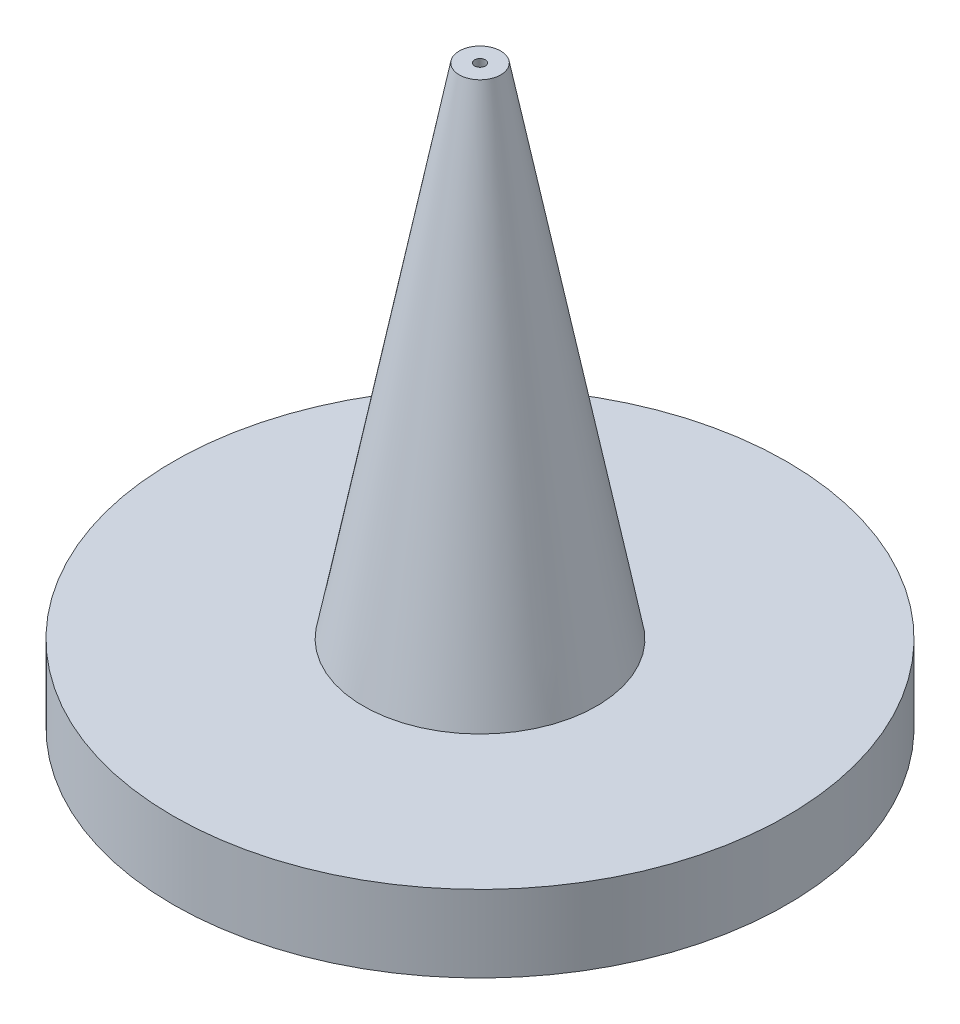
ISO-10303-21;
HEADER;
FILE_DESCRIPTION(('STEP AP214'),'2;1');
FILE_NAME('part.step','',(''),(''),'','','');
FILE_SCHEMA(('AUTOMOTIVE_DESIGN { 1 0 10303 214 1 1 1 1 }'));
ENDSEC;
DATA;
#1=APPLICATION_CONTEXT('core data for automotive mechanical design processes');
#2=APPLICATION_PROTOCOL_DEFINITION('international standard','automotive_design',2000,#1);
#3=PRODUCT_CONTEXT('',#1,'mechanical');
#4=PRODUCT('Part','Part','',(#3));
#5=PRODUCT_RELATED_PRODUCT_CATEGORY('part','',(#4));
#6=PRODUCT_DEFINITION_FORMATION('','',#4);
#7=PRODUCT_DEFINITION_CONTEXT('part definition',#1,'design');
#8=PRODUCT_DEFINITION('design','',#6,#7);
#9=PRODUCT_DEFINITION_SHAPE('','',#8);
#10=(LENGTH_UNIT() NAMED_UNIT(*) SI_UNIT(.MILLI.,.METRE.));
#11=(NAMED_UNIT(*) PLANE_ANGLE_UNIT() SI_UNIT($,.RADIAN.));
#12=(NAMED_UNIT(*) SI_UNIT($,.STERADIAN.) SOLID_ANGLE_UNIT());
#13=UNCERTAINTY_MEASURE_WITH_UNIT(LENGTH_MEASURE(1.E-05),#10,'distance_accuracy_value','');
#14=(GEOMETRIC_REPRESENTATION_CONTEXT(3) GLOBAL_UNCERTAINTY_ASSIGNED_CONTEXT((#13)) GLOBAL_UNIT_ASSIGNED_CONTEXT((#10,
#11,#12)) REPRESENTATION_CONTEXT('',''));
#15=CARTESIAN_POINT('',(0.,0.,0.));
#16=DIRECTION('',(0.,0.,1.));
#17=DIRECTION('',(1.,0.,0.));
#18=AXIS2_PLACEMENT_3D('',#15,#16,#17);
#19=CARTESIAN_POINT('',(0.,0.,0.));
#20=DIRECTION('',(0.,-1.,0.));
#21=DIRECTION('',(0.,0.,-1.));
#22=AXIS2_PLACEMENT_3D('',#19,#20,#21);
#23=CYLINDRICAL_SURFACE('',#22,10.16);
#24=CARTESIAN_POINT('',(0.,2.54,0.));
#25=DIRECTION('',(0.,-1.,0.));
#26=DIRECTION('',(0.,0.,-1.));
#27=AXIS2_PLACEMENT_3D('',#24,#25,#26);
#28=CIRCLE('',#27,10.16);
#29=CARTESIAN_POINT('',(0.,2.54,-10.16));
#30=VERTEX_POINT('',#29);
#31=EDGE_CURVE('E10',#30,#30,#28,.T.);
#32=ORIENTED_EDGE('',*,*,#31,.T.);
#33=EDGE_LOOP('',(#32));
#34=FACE_BOUND('',#33,.T.);
#35=CARTESIAN_POINT('',(0.,0.,0.));
#36=DIRECTION('',(0.,-1.,0.));
#37=DIRECTION('',(0.,0.,-1.));
#38=AXIS2_PLACEMENT_3D('',#35,#36,#37);
#39=CIRCLE('',#38,10.16);
#40=CARTESIAN_POINT('',(0.,0.,-10.16));
#41=VERTEX_POINT('',#40);
#42=EDGE_CURVE('E54',#41,#41,#39,.T.);
#43=ORIENTED_EDGE('',*,*,#42,.F.);
#44=EDGE_LOOP('',(#43));
#45=FACE_BOUND('',#44,.T.);
#46=ADVANCED_FACE('F32',(#34,#45),#23,.T.);
#47=CARTESIAN_POINT('',(0.,2.54,0.));
#48=DIRECTION('',(0.,1.,0.));
#49=DIRECTION('',(0.,0.,1.));
#50=AXIS2_PLACEMENT_3D('',#47,#48,#49);
#51=PLANE('',#50);
#52=CARTESIAN_POINT('',(0.,2.54,0.));
#53=DIRECTION('',(0.,-1.,0.));
#54=DIRECTION('',(0.,0.,-1.));
#55=AXIS2_PLACEMENT_3D('',#52,#53,#54);
#56=CIRCLE('',#55,3.8608);
#57=CARTESIAN_POINT('',(0.,2.54,-3.8608));
#58=VERTEX_POINT('',#57);
#59=EDGE_CURVE('E38',#58,#58,#56,.T.);
#60=ORIENTED_EDGE('',*,*,#59,.T.);
#61=EDGE_LOOP('',(#60));
#62=FACE_BOUND('',#61,.T.);
#63=ORIENTED_EDGE('',*,*,#31,.F.);
#64=EDGE_LOOP('',(#63));
#65=FACE_BOUND('',#64,.T.);
#66=ADVANCED_FACE('F62',(#62,#65),#51,.T.);
#67=CARTESIAN_POINT('',(0.,19.05,0.));
#68=DIRECTION('',(0.,-1.,0.));
#69=DIRECTION('',(0.,0.,-1.));
#70=AXIS2_PLACEMENT_3D('',#67,#68,#69);
#71=CONICAL_SURFACE('',#70,0.6858,0.189988287918716);
#72=CARTESIAN_POINT('',(0.,19.05,0.));
#73=DIRECTION('',(0.,-1.,0.));
#74=DIRECTION('',(0.,0.,-1.));
#75=AXIS2_PLACEMENT_3D('',#72,#73,#74);
#76=CIRCLE('',#75,0.6858);
#77=CARTESIAN_POINT('',(0.,19.05,-0.6858));
#78=VERTEX_POINT('',#77);
#79=EDGE_CURVE('E42',#78,#78,#76,.T.);
#80=CARTESIAN_POINT('',(0.,2.54,-3.8608));
#81=CARTESIAN_POINT('',(0.,2.71197916666667,-3.82772708333333));
#82=CARTESIAN_POINT('',(0.,2.88395833333333,-3.79465416666667));
#83=CARTESIAN_POINT('',(0.,3.22791666666667,-3.72850833333333));
#84=CARTESIAN_POINT('',(0.,3.39989583333333,-3.69543541666667));
#85=CARTESIAN_POINT('',(0.,3.74385416666667,-3.62928958333333));
#86=CARTESIAN_POINT('',(0.,3.91583333333333,-3.59621666666667));
#87=CARTESIAN_POINT('',(0.,4.25979166666667,-3.53007083333333));
#88=CARTESIAN_POINT('',(0.,4.43177083333333,-3.49699791666667));
#89=CARTESIAN_POINT('',(0.,4.77572916666667,-3.43085208333333));
#90=CARTESIAN_POINT('',(0.,4.94770833333333,-3.39777916666667));
#91=CARTESIAN_POINT('',(0.,5.29166666666667,-3.33163333333333));
#92=CARTESIAN_POINT('',(0.,5.46364583333334,-3.29856041666667));
#93=CARTESIAN_POINT('',(0.,5.80760416666667,-3.23241458333333));
#94=CARTESIAN_POINT('',(0.,5.97958333333333,-3.19934166666667));
#95=CARTESIAN_POINT('',(0.,6.32354166666667,-3.13319583333333));
#96=CARTESIAN_POINT('',(0.,6.49552083333333,-3.10012291666667));
#97=CARTESIAN_POINT('',(0.,6.83947916666667,-3.03397708333333));
#98=CARTESIAN_POINT('',(0.,7.01145833333333,-3.00090416666667));
#99=CARTESIAN_POINT('',(0.,7.35541666666667,-2.93475833333333));
#100=CARTESIAN_POINT('',(0.,7.52739583333334,-2.90168541666667));
#101=CARTESIAN_POINT('',(0.,7.87135416666667,-2.83553958333333));
#102=CARTESIAN_POINT('',(0.,8.04333333333333,-2.80246666666667));
#103=CARTESIAN_POINT('',(0.,8.38729166666667,-2.73632083333333));
#104=CARTESIAN_POINT('',(0.,8.55927083333333,-2.70324791666667));
#105=CARTESIAN_POINT('',(0.,8.90322916666667,-2.63710208333333));
#106=CARTESIAN_POINT('',(0.,9.07520833333333,-2.60402916666667));
#107=CARTESIAN_POINT('',(0.,9.41916666666667,-2.53788333333333));
#108=CARTESIAN_POINT('',(0.,9.59114583333333,-2.50481041666667));
#109=CARTESIAN_POINT('',(0.,9.93510416666667,-2.43866458333333));
#110=CARTESIAN_POINT('',(0.,10.1070833333333,-2.40559166666667));
#111=CARTESIAN_POINT('',(0.,10.4510416666667,-2.33944583333333));
#112=CARTESIAN_POINT('',(0.,10.6230208333333,-2.30637291666667));
#113=CARTESIAN_POINT('',(0.,10.9669791666667,-2.24022708333333));
#114=CARTESIAN_POINT('',(0.,11.1389583333333,-2.20715416666667));
#115=CARTESIAN_POINT('',(0.,11.4829166666667,-2.14100833333333));
#116=CARTESIAN_POINT('',(0.,11.6548958333333,-2.10793541666667));
#117=CARTESIAN_POINT('',(0.,11.9988541666667,-2.04178958333333));
#118=CARTESIAN_POINT('',(0.,12.1708333333333,-2.00871666666667));
#119=CARTESIAN_POINT('',(0.,12.5147916666667,-1.94257083333333));
#120=CARTESIAN_POINT('',(0.,12.6867708333333,-1.90949791666667));
#121=CARTESIAN_POINT('',(0.,13.0307291666667,-1.84335208333333));
#122=CARTESIAN_POINT('',(0.,13.2027083333333,-1.81027916666667));
#123=CARTESIAN_POINT('',(0.,13.5466666666667,-1.74413333333333));
#124=CARTESIAN_POINT('',(0.,13.7186458333333,-1.71106041666667));
#125=CARTESIAN_POINT('',(0.,14.0626041666667,-1.64491458333333));
#126=CARTESIAN_POINT('',(0.,14.2345833333333,-1.61184166666667));
#127=CARTESIAN_POINT('',(0.,14.5785416666667,-1.54569583333333));
#128=CARTESIAN_POINT('',(0.,14.7505208333333,-1.51262291666667));
#129=CARTESIAN_POINT('',(0.,15.0944791666667,-1.44647708333333));
#130=CARTESIAN_POINT('',(0.,15.2664583333333,-1.41340416666667));
#131=CARTESIAN_POINT('',(0.,15.6104166666667,-1.34725833333333));
#132=CARTESIAN_POINT('',(0.,15.7823958333333,-1.31418541666667));
#133=CARTESIAN_POINT('',(0.,16.1263541666667,-1.24803958333333));
#134=CARTESIAN_POINT('',(0.,16.2983333333333,-1.21496666666667));
#135=CARTESIAN_POINT('',(0.,16.6422916666667,-1.14882083333333));
#136=CARTESIAN_POINT('',(0.,16.8142708333333,-1.11574791666667));
#137=CARTESIAN_POINT('',(0.,17.1582291666667,-1.04960208333333));
#138=CARTESIAN_POINT('',(0.,17.3302083333333,-1.01652916666667));
#139=CARTESIAN_POINT('',(0.,17.6741666666667,-0.950383333333333));
#140=CARTESIAN_POINT('',(0.,17.8461458333333,-0.917310416666666));
#141=CARTESIAN_POINT('',(0.,18.1901041666667,-0.851164583333333));
#142=CARTESIAN_POINT('',(0.,18.3620833333333,-0.818091666666666));
#143=CARTESIAN_POINT('',(0.,18.7060416666667,-0.751945833333333));
#144=CARTESIAN_POINT('',(0.,18.8780208333333,-0.718872916666666));
#145=CARTESIAN_POINT('',(0.,19.05,-0.685799999999999));
#146=B_SPLINE_CURVE_WITH_KNOTS('',3,(#80,#81,#82,#83,#84,#85,#86,#87,#88,#89,#90,#91,#92,#93,
#94,#95,#96,#97,#98,#99,#100,#101,#102,#103,#104,#105,#106,#107,#108,#109,#110,#111,#112,#113,
#114,#115,#116,#117,#118,#119,#120,#121,#122,#123,#124,#125,#126,#127,#128,#129,#130,#131,#132,
#133,#134,#135,#136,#137,#138,#139,#140,#141,#142,#143,#144,#145),.UNSPECIFIED.,.F.,.F.,(4,2,2,
2,2,2,2,2,2,2,2,2,2,2,2,2,2,2,2,2,2,2,2,2,2,2,2,2,2,2,2,2,4),(0.,0.525391153577802,
1.0507823071556,1.5761734607334,2.1015646143112,2.62695576788901,3.15234692146681,
3.67773807504461,4.20312922862241,4.72852038220021,5.25391153577801,5.77930268935581,
6.30469384293361,6.83008499651141,7.35547615008921,7.88086730366701,8.40625845724482,
8.93164961082262,9.45704076440042,9.98243191797822,10.507823071556,11.0332142251338,
11.5586053787116,12.0839965322894,12.6093876858672,13.134778839445,13.6601699930228,
14.1855611466006,14.7109523001784,15.2363434537562,15.761734607334,16.2871257609118,
16.8125169144896),.UNSPECIFIED.);
#147=EDGE_CURVE('BSEAM66',#58,#78,#146,.T.);
#148=ORIENTED_EDGE('',*,*,#59,.F.);
#149=ORIENTED_EDGE('',*,*,#79,.T.);
#150=ORIENTED_EDGE('',*,*,#147,.T.);
#151=ORIENTED_EDGE('',*,*,#147,.F.);
#152=EDGE_LOOP('',(#148,#150,#149,#151));
#153=FACE_BOUND('',#152,.T.);
#154=ADVANCED_FACE('F66',(#153),#71,.T.);
#155=CARTESIAN_POINT('',(0.,19.05,0.));
#156=DIRECTION('',(0.,-1.,0.));
#157=DIRECTION('',(0.,0.,-1.));
#158=AXIS2_PLACEMENT_3D('',#155,#156,#157);
#159=PLANE('',#158);
#160=ORIENTED_EDGE('',*,*,#79,.F.);
#161=EDGE_LOOP('',(#160));
#162=FACE_BOUND('',#161,.T.);
#163=CARTESIAN_POINT('',(0.,19.05,0.));
#164=DIRECTION('',(0.,-1.,0.));
#165=DIRECTION('',(0.,0.,-1.));
#166=AXIS2_PLACEMENT_3D('',#163,#164,#165);
#167=CIRCLE('',#166,0.1778);
#168=CARTESIAN_POINT('',(0.,19.05,-0.177800000000001));
#169=VERTEX_POINT('',#168);
#170=EDGE_CURVE('E46',#169,#169,#167,.T.);
#171=ORIENTED_EDGE('',*,*,#170,.T.);
#172=EDGE_LOOP('',(#171));
#173=FACE_BOUND('',#172,.T.);
#174=ADVANCED_FACE('F70',(#162,#173),#159,.F.);
#175=CARTESIAN_POINT('',(0.,0.,0.));
#176=DIRECTION('',(0.,-1.,0.));
#177=DIRECTION('',(0.,0.,-1.));
#178=AXIS2_PLACEMENT_3D('',#175,#176,#177);
#179=CONICAL_SURFACE('',#178,3.3528,0.165148677414627);
#180=CARTESIAN_POINT('',(0.,0.,0.));
#181=DIRECTION('',(0.,-1.,0.));
#182=DIRECTION('',(0.,0.,-1.));
#183=AXIS2_PLACEMENT_3D('',#180,#181,#182);
#184=CIRCLE('',#183,3.3528);
#185=CARTESIAN_POINT('',(0.,0.,-3.3528));
#186=VERTEX_POINT('',#185);
#187=EDGE_CURVE('E51',#186,#186,#184,.T.);
#188=CARTESIAN_POINT('',(0.,19.05,-0.177800000000001));
#189=CARTESIAN_POINT('',(0.,18.8515625,-0.210872916666667));
#190=CARTESIAN_POINT('',(0.,18.653125,-0.243945833333334));
#191=CARTESIAN_POINT('',(0.,18.25625,-0.310091666666667));
#192=CARTESIAN_POINT('',(0.,18.0578125,-0.343164583333334));
#193=CARTESIAN_POINT('',(0.,17.6609375,-0.409310416666668));
#194=CARTESIAN_POINT('',(0.,17.4625,-0.442383333333334));
#195=CARTESIAN_POINT('',(0.,17.065625,-0.508529166666667));
#196=CARTESIAN_POINT('',(0.,16.8671875,-0.541602083333334));
#197=CARTESIAN_POINT('',(0.,16.4703125,-0.607747916666667));
#198=CARTESIAN_POINT('',(0.,16.271875,-0.640820833333334));
#199=CARTESIAN_POINT('',(0.,15.875,-0.706966666666667));
#200=CARTESIAN_POINT('',(0.,15.6765625,-0.740039583333334));
#201=CARTESIAN_POINT('',(0.,15.2796875,-0.806185416666667));
#202=CARTESIAN_POINT('',(0.,15.08125,-0.839258333333334));
#203=CARTESIAN_POINT('',(0.,14.684375,-0.905404166666667));
#204=CARTESIAN_POINT('',(0.,14.4859375,-0.938477083333334));
#205=CARTESIAN_POINT('',(0.,14.0890625,-1.00462291666667));
#206=CARTESIAN_POINT('',(0.,13.890625,-1.03769583333333));
#207=CARTESIAN_POINT('',(0.,13.49375,-1.10384166666667));
#208=CARTESIAN_POINT('',(0.,13.2953125,-1.13691458333333));
#209=CARTESIAN_POINT('',(0.,12.8984375,-1.20306041666667));
#210=CARTESIAN_POINT('',(0.,12.7,-1.23613333333333));
#211=CARTESIAN_POINT('',(0.,12.303125,-1.30227916666667));
#212=CARTESIAN_POINT('',(0.,12.1046875,-1.33535208333333));
#213=CARTESIAN_POINT('',(0.,11.7078125,-1.40149791666667));
#214=CARTESIAN_POINT('',(0.,11.509375,-1.43457083333333));
#215=CARTESIAN_POINT('',(0.,11.1125,-1.50071666666667));
#216=CARTESIAN_POINT('',(0.,10.9140625,-1.53378958333333));
#217=CARTESIAN_POINT('',(0.,10.5171875,-1.59993541666667));
#218=CARTESIAN_POINT('',(0.,10.31875,-1.63300833333333));
#219=CARTESIAN_POINT('',(0.,9.921875,-1.69915416666667));
#220=CARTESIAN_POINT('',(0.,9.7234375,-1.73222708333333));
#221=CARTESIAN_POINT('',(0.,9.3265625,-1.79837291666667));
#222=CARTESIAN_POINT('',(0.,9.128125,-1.83144583333333));
#223=CARTESIAN_POINT('',(0.,8.73125,-1.89759166666667));
#224=CARTESIAN_POINT('',(0.,8.5328125,-1.93066458333333));
#225=CARTESIAN_POINT('',(0.,8.1359375,-1.99681041666667));
#226=CARTESIAN_POINT('',(0.,7.9375,-2.02988333333333));
#227=CARTESIAN_POINT('',(0.,7.540625,-2.09602916666667));
#228=CARTESIAN_POINT('',(0.,7.3421875,-2.12910208333333));
#229=CARTESIAN_POINT('',(0.,6.9453125,-2.19524791666667));
#230=CARTESIAN_POINT('',(0.,6.746875,-2.22832083333333));
#231=CARTESIAN_POINT('',(0.,6.35,-2.29446666666667));
#232=CARTESIAN_POINT('',(0.,6.1515625,-2.32753958333333));
#233=CARTESIAN_POINT('',(0.,5.7546875,-2.39368541666667));
#234=CARTESIAN_POINT('',(0.,5.55625,-2.42675833333333));
#235=CARTESIAN_POINT('',(0.,5.159375,-2.49290416666667));
#236=CARTESIAN_POINT('',(0.,4.9609375,-2.52597708333333));
#237=CARTESIAN_POINT('',(0.,4.5640625,-2.59212291666667));
#238=CARTESIAN_POINT('',(0.,4.365625,-2.62519583333333));
#239=CARTESIAN_POINT('',(0.,3.96875,-2.69134166666667));
#240=CARTESIAN_POINT('',(0.,3.7703125,-2.72441458333333));
#241=CARTESIAN_POINT('',(0.,3.3734375,-2.79056041666667));
#242=CARTESIAN_POINT('',(0.,3.175,-2.82363333333333));
#243=CARTESIAN_POINT('',(0.,2.778125,-2.88977916666667));
#244=CARTESIAN_POINT('',(0.,2.5796875,-2.92285208333333));
#245=CARTESIAN_POINT('',(0.,2.1828125,-2.98899791666667));
#246=CARTESIAN_POINT('',(0.,1.984375,-3.02207083333333));
#247=CARTESIAN_POINT('',(0.,1.5875,-3.08821666666667));
#248=CARTESIAN_POINT('',(0.,1.3890625,-3.12128958333333));
#249=CARTESIAN_POINT('',(0.,0.9921875,-3.18743541666667));
#250=CARTESIAN_POINT('',(0.,0.793750000000001,-3.22050833333333));
#251=CARTESIAN_POINT('',(0.,0.396875,-3.28665416666667));
#252=CARTESIAN_POINT('',(0.,0.1984375,-3.31972708333333));
#253=CARTESIAN_POINT('',(0.,0.,-3.3528));
#254=B_SPLINE_CURVE_WITH_KNOTS('',3,(#188,#189,#190,#191,#192,#193,#194,#195,#196,#197,#198,
#199,#200,#201,#202,#203,#204,#205,#206,#207,#208,#209,#210,#211,#212,#213,#214,#215,#216,#217,
#218,#219,#220,#221,#222,#223,#224,#225,#226,#227,#228,#229,#230,#231,#232,#233,#234,#235,#236,
#237,#238,#239,#240,#241,#242,#243,#244,#245,#246,#247,#248,#249,#250,#251,#252,#253),
.UNSPECIFIED.,.F.,.F.,(4,2,2,2,2,2,2,2,2,2,2,2,2,2,2,2,2,2,2,2,2,2,2,2,2,2,2,2,2,2,2,2,4),(0.,
0.603524094803027,1.20704818960605,1.81057228440908,2.41409637921211,3.01762047401513,
3.62114456881816,4.22466866362118,4.82819275842421,5.43171685322724,6.03524094803026,
6.63876504283329,7.24228913763632,7.84581323243934,8.44933732724237,9.05286142204539,
9.65638551684842,10.2599096116514,10.8634337064545,11.4669578012575,12.0704818960605,
12.6740059908636,13.2775300856666,13.8810541804696,14.4845782752726,15.0881023700757,
15.6916264648787,16.2951505596817,16.8986746544847,17.5021987492878,18.1057228440908,
18.7092469388938,19.3127710336969),.UNSPECIFIED.);
#255=EDGE_CURVE('BSEAM77',#169,#186,#254,.T.);
#256=ORIENTED_EDGE('',*,*,#170,.F.);
#257=ORIENTED_EDGE('',*,*,#187,.T.);
#258=ORIENTED_EDGE('',*,*,#255,.T.);
#259=ORIENTED_EDGE('',*,*,#255,.F.);
#260=EDGE_LOOP('',(#256,#258,#257,#259));
#261=FACE_BOUND('',#260,.T.);
#262=ADVANCED_FACE('F77',(#261),#179,.F.);
#263=CARTESIAN_POINT('',(0.,0.,0.));
#264=DIRECTION('',(0.,-1.,0.));
#265=DIRECTION('',(0.,0.,-1.));
#266=AXIS2_PLACEMENT_3D('',#263,#264,#265);
#267=PLANE('',#266);
#268=ORIENTED_EDGE('',*,*,#42,.T.);
#269=EDGE_LOOP('',(#268));
#270=FACE_BOUND('',#269,.T.);
#271=ORIENTED_EDGE('',*,*,#187,.F.);
#272=EDGE_LOOP('',(#271));
#273=FACE_BOUND('',#272,.T.);
#274=ADVANCED_FACE('F58',(#270,#273),#267,.T.);
#275=CLOSED_SHELL('',(#46,#66,#154,#174,#262,#274));
#276=MANIFOLD_SOLID_BREP('B2',#275);
#277=ADVANCED_BREP_SHAPE_REPRESENTATION('',(#18,#276),#14);
#278=SHAPE_DEFINITION_REPRESENTATION(#9,#277);
ENDSEC;
END-ISO-10303-21;
